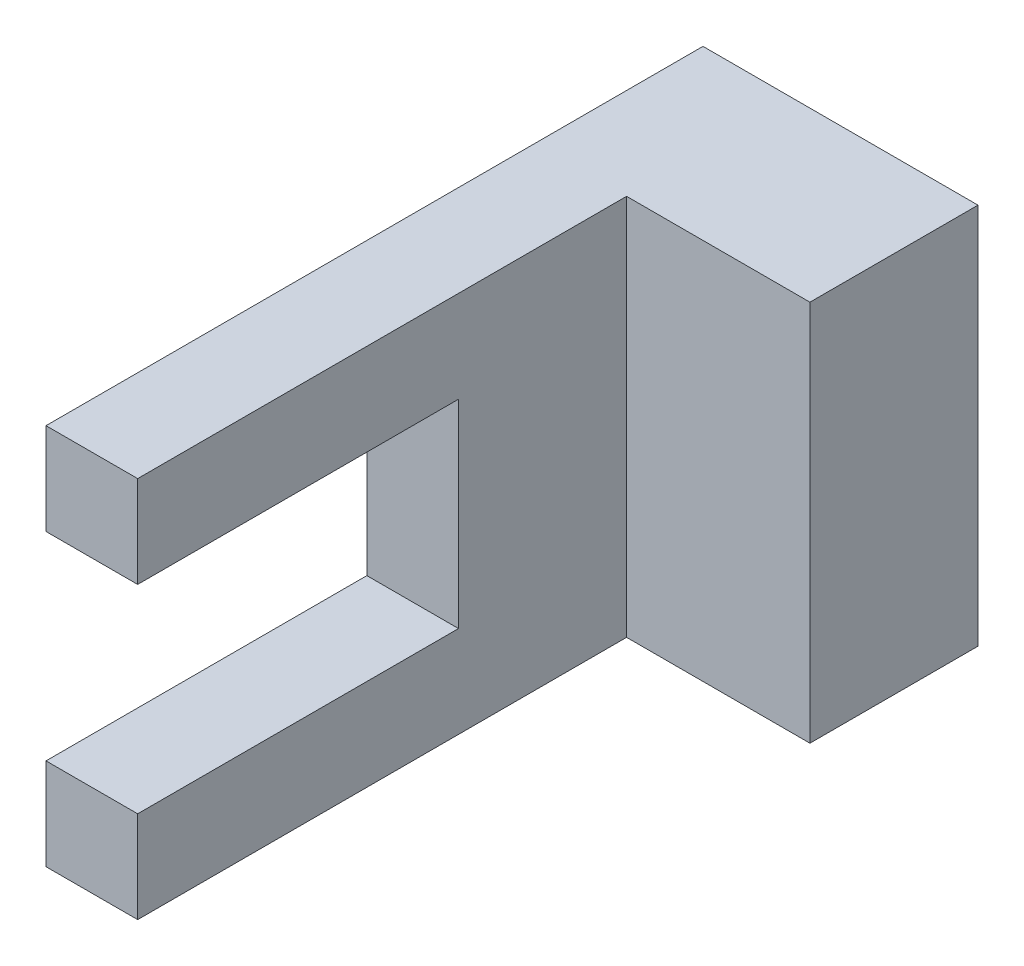
ISO-10303-21;
HEADER;
FILE_DESCRIPTION(('STEP AP214'),'2;1');
FILE_NAME('part.step','',(''),(''),'','','');
FILE_SCHEMA(('AUTOMOTIVE_DESIGN { 1 0 10303 214 1 1 1 1 }'));
ENDSEC;
DATA;
#1=APPLICATION_CONTEXT('core data for automotive mechanical design processes');
#2=APPLICATION_PROTOCOL_DEFINITION('international standard','automotive_design',2000,#1);
#3=PRODUCT_CONTEXT('',#1,'mechanical');
#4=PRODUCT('Part','Part','',(#3));
#5=PRODUCT_RELATED_PRODUCT_CATEGORY('part','',(#4));
#6=PRODUCT_DEFINITION_FORMATION('','',#4);
#7=PRODUCT_DEFINITION_CONTEXT('part definition',#1,'design');
#8=PRODUCT_DEFINITION('design','',#6,#7);
#9=PRODUCT_DEFINITION_SHAPE('','',#8);
#10=(LENGTH_UNIT() NAMED_UNIT(*) SI_UNIT(.MILLI.,.METRE.));
#11=(NAMED_UNIT(*) PLANE_ANGLE_UNIT() SI_UNIT($,.RADIAN.));
#12=(NAMED_UNIT(*) SI_UNIT($,.STERADIAN.) SOLID_ANGLE_UNIT());
#13=UNCERTAINTY_MEASURE_WITH_UNIT(LENGTH_MEASURE(1.E-05),#10,'distance_accuracy_value','');
#14=(GEOMETRIC_REPRESENTATION_CONTEXT(3) GLOBAL_UNCERTAINTY_ASSIGNED_CONTEXT((#13)) GLOBAL_UNIT_ASSIGNED_CONTEXT((#10,
#11,#12)) REPRESENTATION_CONTEXT('',''));
#15=CARTESIAN_POINT('',(0.,0.,0.));
#16=DIRECTION('',(0.,0.,1.));
#17=DIRECTION('',(1.,0.,0.));
#18=AXIS2_PLACEMENT_3D('',#15,#16,#17);
#19=CARTESIAN_POINT('',(18.,-11.3523342728963,-23.5902911986818));
#20=DIRECTION('',(0.,0.,1.));
#21=DIRECTION('',(0.,-1.,0.));
#22=AXIS2_PLACEMENT_3D('',#19,#20,#21);
#23=PLANE('',#22);
#24=DIRECTION('',(0.,1.,0.));
#25=VECTOR('',#24,1.);
#26=CARTESIAN_POINT('',(0.,-11.3523342728963,-23.5902911986818));
#27=LINE('',#26,#25);
#28=CARTESIAN_POINT('',(0.,-11.3523342728963,-23.5902911986818));
#29=VERTEX_POINT('',#28);
#30=CARTESIAN_POINT('',(0.,13.6476657271037,-23.5902911986818));
#31=VERTEX_POINT('',#30);
#32=EDGE_CURVE('E104',#29,#31,#27,.T.);
#33=ORIENTED_EDGE('',*,*,#32,.T.);
#34=DIRECTION('',(-1.,0.,0.));
#35=VECTOR('',#34,1.);
#36=CARTESIAN_POINT('',(18.,13.6476657271037,-23.5902911986818));
#37=LINE('',#36,#35);
#38=CARTESIAN_POINT('',(18.,13.6476657271037,-23.5902911986818));
#39=VERTEX_POINT('',#38);
#40=EDGE_CURVE('E11',#39,#31,#37,.T.);
#41=ORIENTED_EDGE('',*,*,#40,.F.);
#42=DIRECTION('',(0.,1.,0.));
#43=VECTOR('',#42,1.);
#44=CARTESIAN_POINT('',(18.,-11.3523342728963,-23.5902911986818));
#45=LINE('',#44,#43);
#46=CARTESIAN_POINT('',(18.,-11.3523342728963,-23.5902911986818));
#47=VERTEX_POINT('',#46);
#48=EDGE_CURVE('E98',#47,#39,#45,.T.);
#49=ORIENTED_EDGE('',*,*,#48,.F.);
#50=DIRECTION('',(-1.,0.,0.));
#51=VECTOR('',#50,1.);
#52=CARTESIAN_POINT('',(18.,-11.3523342728963,-23.5902911986818));
#53=LINE('',#52,#51);
#54=EDGE_CURVE('E89',#47,#29,#53,.T.);
#55=ORIENTED_EDGE('',*,*,#54,.T.);
#56=EDGE_LOOP('',(#33,#41,#49,#55));
#57=FACE_BOUND('',#56,.T.);
#58=ADVANCED_FACE('F33',(#57),#23,.F.);
#59=CARTESIAN_POINT('',(18.,13.6476657271037,-23.5902911986818));
#60=DIRECTION('',(0.,-1.,0.));
#61=DIRECTION('',(0.,0.,-1.));
#62=AXIS2_PLACEMENT_3D('',#59,#60,#61);
#63=PLANE('',#62);
#64=DIRECTION('',(-1.,0.,0.));
#65=VECTOR('',#64,1.);
#66=CARTESIAN_POINT('',(18.,13.6476657271037,19.4097088013182));
#67=LINE('',#66,#65);
#68=CARTESIAN_POINT('',(6.,13.6476657271037,19.4097088013182));
#69=VERTEX_POINT('',#68);
#70=CARTESIAN_POINT('',(0.,13.6476657271037,19.4097088013182));
#71=VERTEX_POINT('',#70);
#72=EDGE_CURVE('E40',#69,#71,#67,.T.);
#73=ORIENTED_EDGE('',*,*,#72,.F.);
#74=DIRECTION('',(0.,0.,1.));
#75=VECTOR('',#74,1.);
#76=CARTESIAN_POINT('',(6.,13.6476657271037,-12.5902911986818));
#77=LINE('',#76,#75);
#78=CARTESIAN_POINT('',(6.,13.6476657271037,-12.5902911986818));
#79=VERTEX_POINT('',#78);
#80=EDGE_CURVE('E196',#79,#69,#77,.T.);
#81=ORIENTED_EDGE('',*,*,#80,.F.);
#82=DIRECTION('',(-1.,0.,0.));
#83=VECTOR('',#82,1.);
#84=CARTESIAN_POINT('',(18.,13.6476657271037,-12.5902911986818));
#85=LINE('',#84,#83);
#86=CARTESIAN_POINT('',(18.,13.6476657271037,-12.5902911986818));
#87=VERTEX_POINT('',#86);
#88=EDGE_CURVE('E195',#87,#79,#85,.T.);
#89=ORIENTED_EDGE('',*,*,#88,.F.);
#90=DIRECTION('',(0.,0.,1.));
#91=VECTOR('',#90,1.);
#92=CARTESIAN_POINT('',(18.,13.6476657271037,-23.5902911986818));
#93=LINE('',#92,#91);
#94=EDGE_CURVE('E187',#39,#87,#93,.T.);
#95=ORIENTED_EDGE('',*,*,#94,.F.);
#96=ORIENTED_EDGE('',*,*,#40,.T.);
#97=DIRECTION('',(0.,0.,1.));
#98=VECTOR('',#97,1.);
#99=CARTESIAN_POINT('',(0.,13.6476657271037,-23.5902911986818));
#100=LINE('',#99,#98);
#101=EDGE_CURVE('E109',#31,#71,#100,.T.);
#102=ORIENTED_EDGE('',*,*,#101,.T.);
#103=EDGE_LOOP('',(#73,#81,#89,#95,#96,#102));
#104=FACE_BOUND('',#103,.T.);
#105=ADVANCED_FACE('F151',(#104),#63,.F.);
#106=CARTESIAN_POINT('',(18.,13.6476657271037,19.4097088013182));
#107=DIRECTION('',(0.,0.,-1.));
#108=DIRECTION('',(-1.,0.,0.));
#109=AXIS2_PLACEMENT_3D('',#106,#107,#108);
#110=PLANE('',#109);
#111=DIRECTION('',(-1.,0.,0.));
#112=VECTOR('',#111,1.);
#113=CARTESIAN_POINT('',(18.,7.64766572710371,19.4097088013182));
#114=LINE('',#113,#112);
#115=CARTESIAN_POINT('',(6.,7.64766572710371,19.4097088013182));
#116=VERTEX_POINT('',#115);
#117=CARTESIAN_POINT('',(0.,7.64766572710371,19.4097088013182));
#118=VERTEX_POINT('',#117);
#119=EDGE_CURVE('E139',#116,#118,#114,.T.);
#120=ORIENTED_EDGE('',*,*,#119,.F.);
#121=DIRECTION('',(0.,-1.,0.));
#122=VECTOR('',#121,1.);
#123=CARTESIAN_POINT('',(6.,13.6476657271037,19.4097088013182));
#124=LINE('',#123,#122);
#125=EDGE_CURVE('E148',#69,#116,#124,.T.);
#126=ORIENTED_EDGE('',*,*,#125,.F.);
#127=ORIENTED_EDGE('',*,*,#72,.T.);
#128=DIRECTION('',(0.,-1.,0.));
#129=VECTOR('',#128,1.);
#130=CARTESIAN_POINT('',(0.,13.6476657271037,19.4097088013182));
#131=LINE('',#130,#129);
#132=EDGE_CURVE('E112',#71,#118,#131,.T.);
#133=ORIENTED_EDGE('',*,*,#132,.T.);
#134=EDGE_LOOP('',(#120,#126,#127,#133));
#135=FACE_BOUND('',#134,.T.);
#136=ADVANCED_FACE('F144',(#135),#110,.F.);
#137=CARTESIAN_POINT('',(18.,7.64766572710371,19.4097088013182));
#138=DIRECTION('',(0.,1.,0.));
#139=DIRECTION('',(0.,0.,1.));
#140=AXIS2_PLACEMENT_3D('',#137,#138,#139);
#141=PLANE('',#140);
#142=DIRECTION('',(-1.,0.,0.));
#143=VECTOR('',#142,1.);
#144=CARTESIAN_POINT('',(18.,7.64766572710371,-1.59029119868184));
#145=LINE('',#144,#143);
#146=CARTESIAN_POINT('',(6.,7.64766572710371,-1.59029119868184));
#147=VERTEX_POINT('',#146);
#148=CARTESIAN_POINT('',(0.,7.64766572710371,-1.59029119868184));
#149=VERTEX_POINT('',#148);
#150=EDGE_CURVE('E137',#147,#149,#145,.T.);
#151=ORIENTED_EDGE('',*,*,#150,.F.);
#152=DIRECTION('',(0.,0.,1.));
#153=VECTOR('',#152,1.);
#154=CARTESIAN_POINT('',(6.,7.64766572710371,19.4097088013182));
#155=LINE('',#154,#153);
#156=EDGE_CURVE('E110',#147,#116,#155,.T.);
#157=ORIENTED_EDGE('',*,*,#156,.T.);
#158=ORIENTED_EDGE('',*,*,#119,.T.);
#159=DIRECTION('',(0.,0.,-1.));
#160=VECTOR('',#159,1.);
#161=CARTESIAN_POINT('',(0.,7.64766572710371,19.4097088013182));
#162=LINE('',#161,#160);
#163=EDGE_CURVE('E122',#118,#149,#162,.T.);
#164=ORIENTED_EDGE('',*,*,#163,.T.);
#165=EDGE_LOOP('',(#151,#157,#158,#164));
#166=FACE_BOUND('',#165,.T.);
#167=ADVANCED_FACE('F156',(#166),#141,.F.);
#168=CARTESIAN_POINT('',(18.,7.64766572710371,-1.59029119868184));
#169=DIRECTION('',(0.,0.,-1.));
#170=DIRECTION('',(0.,1.,0.));
#171=AXIS2_PLACEMENT_3D('',#168,#169,#170);
#172=PLANE('',#171);
#173=DIRECTION('',(-1.,0.,0.));
#174=VECTOR('',#173,1.);
#175=CARTESIAN_POINT('',(18.,-5.35233427289629,-1.59029119868183));
#176=LINE('',#175,#174);
#177=CARTESIAN_POINT('',(6.,-5.35233427289629,-1.59029119868183));
#178=VERTEX_POINT('',#177);
#179=CARTESIAN_POINT('',(0.,-5.35233427289629,-1.59029119868183));
#180=VERTEX_POINT('',#179);
#181=EDGE_CURVE('E135',#178,#180,#176,.T.);
#182=ORIENTED_EDGE('',*,*,#181,.F.);
#183=DIRECTION('',(0.,1.,0.));
#184=VECTOR('',#183,1.);
#185=CARTESIAN_POINT('',(6.,7.64766572710371,-1.59029119868184));
#186=LINE('',#185,#184);
#187=EDGE_CURVE('E115',#178,#147,#186,.T.);
#188=ORIENTED_EDGE('',*,*,#187,.T.);
#189=ORIENTED_EDGE('',*,*,#150,.T.);
#190=DIRECTION('',(0.,-1.,0.));
#191=VECTOR('',#190,1.);
#192=CARTESIAN_POINT('',(0.,7.64766572710371,-1.59029119868184));
#193=LINE('',#192,#191);
#194=EDGE_CURVE('E125',#149,#180,#193,.T.);
#195=ORIENTED_EDGE('',*,*,#194,.T.);
#196=EDGE_LOOP('',(#182,#188,#189,#195));
#197=FACE_BOUND('',#196,.T.);
#198=ADVANCED_FACE('F180',(#197),#172,.F.);
#199=CARTESIAN_POINT('',(18.,-5.35233427289629,-1.59029119868183));
#200=DIRECTION('',(0.,-1.,0.));
#201=DIRECTION('',(0.,0.,-1.));
#202=AXIS2_PLACEMENT_3D('',#199,#200,#201);
#203=PLANE('',#202);
#204=DIRECTION('',(-1.,0.,0.));
#205=VECTOR('',#204,1.);
#206=CARTESIAN_POINT('',(18.,-5.35233427289629,19.4097088013182));
#207=LINE('',#206,#205);
#208=CARTESIAN_POINT('',(6.,-5.35233427289629,19.4097088013182));
#209=VERTEX_POINT('',#208);
#210=CARTESIAN_POINT('',(0.,-5.35233427289629,19.4097088013182));
#211=VERTEX_POINT('',#210);
#212=EDGE_CURVE('E133',#209,#211,#207,.T.);
#213=ORIENTED_EDGE('',*,*,#212,.F.);
#214=DIRECTION('',(0.,0.,-1.));
#215=VECTOR('',#214,1.);
#216=CARTESIAN_POINT('',(6.,-5.35233427289629,-1.59029119868183));
#217=LINE('',#216,#215);
#218=EDGE_CURVE('E181',#209,#178,#217,.T.);
#219=ORIENTED_EDGE('',*,*,#218,.T.);
#220=ORIENTED_EDGE('',*,*,#181,.T.);
#221=DIRECTION('',(0.,0.,1.));
#222=VECTOR('',#221,1.);
#223=CARTESIAN_POINT('',(0.,-5.35233427289629,-1.59029119868183));
#224=LINE('',#223,#222);
#225=EDGE_CURVE('E128',#180,#211,#224,.T.);
#226=ORIENTED_EDGE('',*,*,#225,.T.);
#227=EDGE_LOOP('',(#213,#219,#220,#226));
#228=FACE_BOUND('',#227,.T.);
#229=ADVANCED_FACE('F213',(#228),#203,.F.);
#230=CARTESIAN_POINT('',(18.,-5.35233427289629,19.4097088013182));
#231=DIRECTION('',(0.,0.,-1.));
#232=DIRECTION('',(0.,1.,0.));
#233=AXIS2_PLACEMENT_3D('',#230,#231,#232);
#234=PLANE('',#233);
#235=DIRECTION('',(-1.,0.,0.));
#236=VECTOR('',#235,1.);
#237=CARTESIAN_POINT('',(18.,-11.3523342728963,19.4097088013182));
#238=LINE('',#237,#236);
#239=CARTESIAN_POINT('',(6.,-11.3523342728963,19.4097088013182));
#240=VERTEX_POINT('',#239);
#241=CARTESIAN_POINT('',(0.,-11.3523342728963,19.4097088013182));
#242=VERTEX_POINT('',#241);
#243=EDGE_CURVE('E93',#240,#242,#238,.T.);
#244=ORIENTED_EDGE('',*,*,#243,.F.);
#245=EDGE_CURVE('E204',#209,#240,#124,.T.);
#246=ORIENTED_EDGE('',*,*,#245,.F.);
#247=ORIENTED_EDGE('',*,*,#212,.T.);
#248=DIRECTION('',(0.,-1.,0.));
#249=VECTOR('',#248,1.);
#250=CARTESIAN_POINT('',(0.,-5.35233427289629,19.4097088013182));
#251=LINE('',#250,#249);
#252=EDGE_CURVE('E99',#211,#242,#251,.T.);
#253=ORIENTED_EDGE('',*,*,#252,.T.);
#254=EDGE_LOOP('',(#244,#246,#247,#253));
#255=FACE_BOUND('',#254,.T.);
#256=ADVANCED_FACE('F211',(#255),#234,.F.);
#257=CARTESIAN_POINT('',(18.,-11.3523342728963,19.4097088013182));
#258=DIRECTION('',(0.,1.,0.));
#259=DIRECTION('',(0.,0.,1.));
#260=AXIS2_PLACEMENT_3D('',#257,#258,#259);
#261=PLANE('',#260);
#262=DIRECTION('',(1.,0.,0.));
#263=VECTOR('',#262,1.);
#264=CARTESIAN_POINT('',(18.,-11.3523342728963,-12.5902911986818));
#265=LINE('',#264,#263);
#266=CARTESIAN_POINT('',(6.,-11.3523342728963,-12.5902911986818));
#267=VERTEX_POINT('',#266);
#268=CARTESIAN_POINT('',(18.,-11.3523342728963,-12.5902911986818));
#269=VERTEX_POINT('',#268);
#270=EDGE_CURVE('E47',#267,#269,#265,.T.);
#271=ORIENTED_EDGE('',*,*,#270,.F.);
#272=DIRECTION('',(0.,0.,1.));
#273=VECTOR('',#272,1.);
#274=CARTESIAN_POINT('',(6.,-11.3523342728963,-12.5902911986818));
#275=LINE('',#274,#273);
#276=EDGE_CURVE('E183',#267,#240,#275,.T.);
#277=ORIENTED_EDGE('',*,*,#276,.T.);
#278=ORIENTED_EDGE('',*,*,#243,.T.);
#279=DIRECTION('',(0.,0.,-1.));
#280=VECTOR('',#279,1.);
#281=CARTESIAN_POINT('',(0.,-11.3523342728963,19.4097088013182));
#282=LINE('',#281,#280);
#283=EDGE_CURVE('E86',#242,#29,#282,.T.);
#284=ORIENTED_EDGE('',*,*,#283,.T.);
#285=ORIENTED_EDGE('',*,*,#54,.F.);
#286=DIRECTION('',(0.,0.,-1.));
#287=VECTOR('',#286,1.);
#288=CARTESIAN_POINT('',(18.,-11.3523342728963,19.4097088013182));
#289=LINE('',#288,#287);
#290=EDGE_CURVE('E55',#269,#47,#289,.T.);
#291=ORIENTED_EDGE('',*,*,#290,.F.);
#292=EDGE_LOOP('',(#271,#277,#278,#284,#285,#291));
#293=FACE_BOUND('',#292,.T.);
#294=ADVANCED_FACE('F88',(#293),#261,.F.);
#295=CARTESIAN_POINT('',(18.,0.,0.));
#296=DIRECTION('',(1.,0.,0.));
#297=DIRECTION('',(0.,0.,-1.));
#298=AXIS2_PLACEMENT_3D('',#295,#296,#297);
#299=PLANE('',#298);
#300=DIRECTION('',(0.,1.,0.));
#301=VECTOR('',#300,1.);
#302=CARTESIAN_POINT('',(18.,13.6476657271037,-12.5902911986818));
#303=LINE('',#302,#301);
#304=EDGE_CURVE('E191',#269,#87,#303,.T.);
#305=ORIENTED_EDGE('',*,*,#304,.F.);
#306=ORIENTED_EDGE('',*,*,#290,.T.);
#307=ORIENTED_EDGE('',*,*,#48,.T.);
#308=ORIENTED_EDGE('',*,*,#94,.T.);
#309=EDGE_LOOP('',(#305,#306,#307,#308));
#310=FACE_BOUND('',#309,.T.);
#311=ADVANCED_FACE('F190',(#310),#299,.T.);
#312=CARTESIAN_POINT('',(0.,0.,0.));
#313=DIRECTION('',(1.,0.,0.));
#314=DIRECTION('',(0.,0.,-1.));
#315=AXIS2_PLACEMENT_3D('',#312,#313,#314);
#316=PLANE('',#315);
#317=ORIENTED_EDGE('',*,*,#32,.F.);
#318=ORIENTED_EDGE('',*,*,#283,.F.);
#319=ORIENTED_EDGE('',*,*,#252,.F.);
#320=ORIENTED_EDGE('',*,*,#225,.F.);
#321=ORIENTED_EDGE('',*,*,#194,.F.);
#322=ORIENTED_EDGE('',*,*,#163,.F.);
#323=ORIENTED_EDGE('',*,*,#132,.F.);
#324=ORIENTED_EDGE('',*,*,#101,.F.);
#325=EDGE_LOOP('',(#317,#318,#319,#320,#321,#322,#323,#324));
#326=FACE_BOUND('',#325,.T.);
#327=ADVANCED_FACE('F106',(#326),#316,.F.);
#328=CARTESIAN_POINT('',(6.,13.6476657271037,-12.5902911986818));
#329=DIRECTION('',(-1.,0.,0.));
#330=DIRECTION('',(0.,-1.,0.));
#331=AXIS2_PLACEMENT_3D('',#328,#329,#330);
#332=PLANE('',#331);
#333=ORIENTED_EDGE('',*,*,#187,.F.);
#334=ORIENTED_EDGE('',*,*,#218,.F.);
#335=ORIENTED_EDGE('',*,*,#245,.T.);
#336=ORIENTED_EDGE('',*,*,#276,.F.);
#337=DIRECTION('',(0.,-1.,0.));
#338=VECTOR('',#337,1.);
#339=CARTESIAN_POINT('',(6.,13.6476657271037,-12.5902911986818));
#340=LINE('',#339,#338);
#341=EDGE_CURVE('E197',#79,#267,#340,.T.);
#342=ORIENTED_EDGE('',*,*,#341,.F.);
#343=ORIENTED_EDGE('',*,*,#80,.T.);
#344=ORIENTED_EDGE('',*,*,#125,.T.);
#345=ORIENTED_EDGE('',*,*,#156,.F.);
#346=EDGE_LOOP('',(#333,#334,#335,#336,#342,#343,#344,#345));
#347=FACE_BOUND('',#346,.T.);
#348=ADVANCED_FACE('F176',(#347),#332,.F.);
#349=CARTESIAN_POINT('',(0.,0.,-12.5902911986818));
#350=DIRECTION('',(0.,0.,-1.));
#351=DIRECTION('',(-1.,0.,0.));
#352=AXIS2_PLACEMENT_3D('',#349,#350,#351);
#353=PLANE('',#352);
#354=ORIENTED_EDGE('',*,*,#304,.T.);
#355=ORIENTED_EDGE('',*,*,#88,.T.);
#356=ORIENTED_EDGE('',*,*,#341,.T.);
#357=ORIENTED_EDGE('',*,*,#270,.T.);
#358=EDGE_LOOP('',(#354,#355,#356,#357));
#359=FACE_BOUND('',#358,.T.);
#360=ADVANCED_FACE('F277',(#359),#353,.F.);
#361=CLOSED_SHELL('',(#58,#105,#136,#167,#198,#229,#256,#294,#311,#327,#348,#360));
#362=MANIFOLD_SOLID_BREP('B2',#361);
#363=ADVANCED_BREP_SHAPE_REPRESENTATION('',(#18,#362),#14);
#364=SHAPE_DEFINITION_REPRESENTATION(#9,#363);
ENDSEC;
END-ISO-10303-21;
